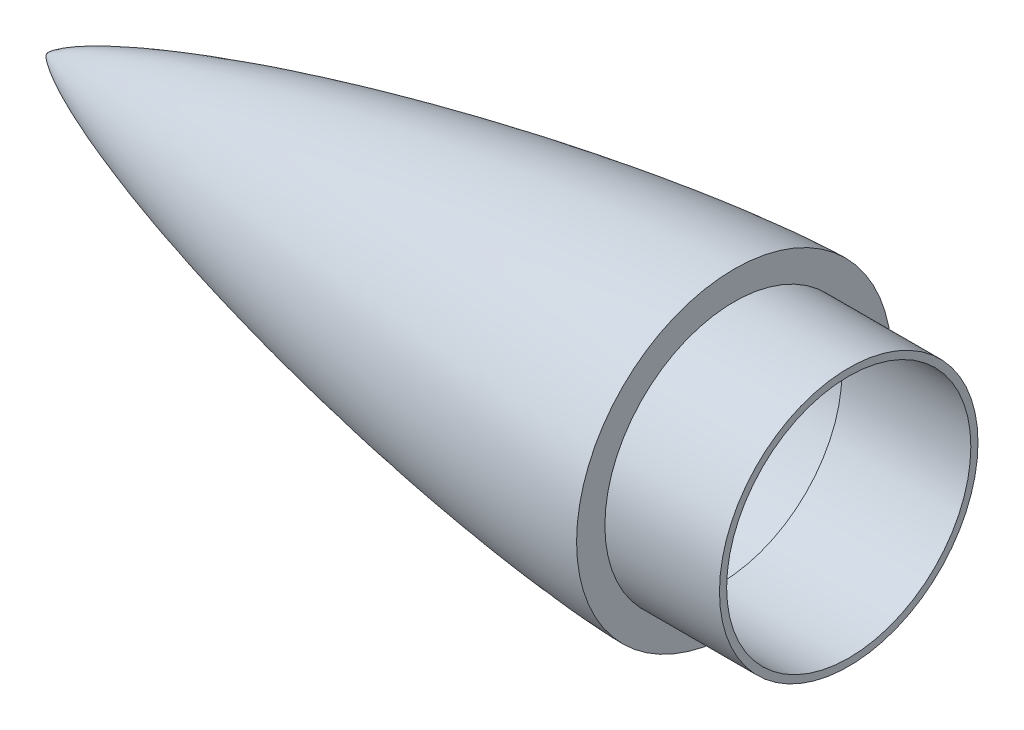
ISO-10303-21;
HEADER;
FILE_DESCRIPTION(('STEP AP214'),'2;1');
FILE_NAME('part.step','',(''),(''),'','','');
FILE_SCHEMA(('AUTOMOTIVE_DESIGN { 1 0 10303 214 1 1 1 1 }'));
ENDSEC;
DATA;
#1=APPLICATION_CONTEXT('core data for automotive mechanical design processes');
#2=APPLICATION_PROTOCOL_DEFINITION('international standard','automotive_design',2000,#1);
#3=PRODUCT_CONTEXT('',#1,'mechanical');
#4=PRODUCT('Part','Part','',(#3));
#5=PRODUCT_RELATED_PRODUCT_CATEGORY('part','',(#4));
#6=PRODUCT_DEFINITION_FORMATION('','',#4);
#7=PRODUCT_DEFINITION_CONTEXT('part definition',#1,'design');
#8=PRODUCT_DEFINITION('design','',#6,#7);
#9=PRODUCT_DEFINITION_SHAPE('','',#8);
#10=(LENGTH_UNIT() NAMED_UNIT(*) SI_UNIT(.MILLI.,.METRE.));
#11=(NAMED_UNIT(*) PLANE_ANGLE_UNIT() SI_UNIT($,.RADIAN.));
#12=(NAMED_UNIT(*) SI_UNIT($,.STERADIAN.) SOLID_ANGLE_UNIT());
#13=UNCERTAINTY_MEASURE_WITH_UNIT(LENGTH_MEASURE(1.E-05),#10,'distance_accuracy_value','');
#14=(GEOMETRIC_REPRESENTATION_CONTEXT(3) GLOBAL_UNCERTAINTY_ASSIGNED_CONTEXT((#13)) GLOBAL_UNIT_ASSIGNED_CONTEXT((#10,
#11,#12)) REPRESENTATION_CONTEXT('',''));
#15=CARTESIAN_POINT('',(0.,0.,0.));
#16=DIRECTION('',(0.,0.,1.));
#17=DIRECTION('',(1.,0.,0.));
#18=AXIS2_PLACEMENT_3D('',#15,#16,#17);
#19=CARTESIAN_POINT('',(177.8,0.,0.));
#20=DIRECTION('',(1.,0.,0.));
#21=DIRECTION('',(0.,0.,-1.));
#22=AXIS2_PLACEMENT_3D('',#19,#20,#21);
#23=PLANE('',#22);
#24=CARTESIAN_POINT('',(177.8,0.,0.));
#25=DIRECTION('',(1.,0.,0.));
#26=DIRECTION('',(0.,0.,-1.));
#27=AXIS2_PLACEMENT_3D('',#24,#25,#26);
#28=CIRCLE('',#27,27.0637);
#29=CARTESIAN_POINT('',(177.8,0.,-27.0637));
#30=VERTEX_POINT('',#29);
#31=EDGE_CURVE('E180',#30,#30,#28,.T.);
#32=ORIENTED_EDGE('',*,*,#31,.F.);
#33=EDGE_LOOP('',(#32));
#34=FACE_BOUND('',#33,.T.);
#35=CARTESIAN_POINT('',(177.8,0.,0.));
#36=DIRECTION('',(1.,0.,0.));
#37=DIRECTION('',(0.,0.,-1.));
#38=AXIS2_PLACEMENT_3D('',#35,#36,#37);
#39=CIRCLE('',#38,28.6512);
#40=CARTESIAN_POINT('',(177.8,0.,-28.6512));
#41=VERTEX_POINT('',#40);
#42=EDGE_CURVE('E75',#41,#41,#39,.T.);
#43=ORIENTED_EDGE('',*,*,#42,.T.);
#44=EDGE_LOOP('',(#43));
#45=FACE_BOUND('',#44,.T.);
#46=ADVANCED_FACE('F45',(#34,#45),#23,.T.);
#47=CARTESIAN_POINT('',(71.362168763472,0.,0.));
#48=DIRECTION('',(1.,0.,0.));
#49=DIRECTION('',(0.,0.,-1.));
#50=AXIS2_PLACEMENT_3D('',#47,#48,#49);
#51=CYLINDRICAL_SURFACE('',#50,28.6512);
#52=ORIENTED_EDGE('',*,*,#42,.F.);
#53=EDGE_LOOP('',(#52));
#54=FACE_BOUND('',#53,.T.);
#55=CARTESIAN_POINT('',(152.4,0.,0.));
#56=DIRECTION('',(-1.,0.,0.));
#57=DIRECTION('',(0.,0.,1.));
#58=AXIS2_PLACEMENT_3D('',#55,#56,#57);
#59=CIRCLE('',#58,28.6512);
#60=CARTESIAN_POINT('',(152.4,0.,28.6512));
#61=VERTEX_POINT('',#60);
#62=EDGE_CURVE('E70',#61,#61,#59,.F.);
#63=ORIENTED_EDGE('',*,*,#62,.T.);
#64=EDGE_LOOP('',(#63));
#65=FACE_BOUND('',#64,.T.);
#66=ADVANCED_FACE('F94',(#54,#65),#51,.T.);
#67=CARTESIAN_POINT('',(152.4,34.925,0.));
#68=CARTESIAN_POINT('',(151.638620403702,34.9194325249245,0.));
#69=CARTESIAN_POINT('',(150.116291690404,34.8790390472772,0.));
#70=CARTESIAN_POINT('',(146.127711045371,34.7091570131924,0.));
#71=CARTESIAN_POINT('',(139.681201199576,34.2625408582786,0.));
#72=CARTESIAN_POINT('',(131.546640375975,33.5052440705498,0.));
#73=CARTESIAN_POINT('',(121.735757233919,32.3602207304823,0.));
#74=CARTESIAN_POINT('',(111.94913797379,31.0255536240622,0.));
#75=CARTESIAN_POINT('',(102.187264387121,29.5206815706249,0.));
#76=CARTESIAN_POINT('',(92.4511603041206,27.8577465560751,0.));
#77=CARTESIAN_POINT('',(82.7423972328781,26.0418601860915,0.));
#78=CARTESIAN_POINT('',(73.0633276580109,24.0739458337446,0.));
#79=CARTESIAN_POINT('',(63.4171761954773,21.9502079468408,0.));
#80=CARTESIAN_POINT('',(53.8087242934331,19.6618360702933,0.));
#81=CARTESIAN_POINT('',(44.2446567136395,17.1937502861845,0.));
#82=CARTESIAN_POINT('',(34.7357419206715,14.520517201272,0.));
#83=CARTESIAN_POINT('',(25.5104046531744,11.6665355833011,0.));
#84=CARTESIAN_POINT('',(17.5514722834625,8.91057275298538,0.));
#85=CARTESIAN_POINT('',(11.1670070265519,6.40395576528129,0.));
#86=CARTESIAN_POINT('',(6.67803927516961,4.37287257201954,0.));
#87=CARTESIAN_POINT('',(4.00847873967701,2.99416996745783,0.));
#88=CARTESIAN_POINT('',(2.31812751021087,1.98889969974508,0.));
#89=CARTESIAN_POINT('',(1.34348677876688,1.32206697154695,0.));
#90=CARTESIAN_POINT('',(0.781053510275957,0.880548595209868,0.));
#91=CARTESIAN_POINT('',(0.455946687706086,0.58803699710236,0.));
#92=CARTESIAN_POINT('',(0.271737065795398,0.398631991697191,0.));
#93=CARTESIAN_POINT('',(0.161926751431604,0.270389036460891,0.));
#94=CARTESIAN_POINT('',(0.0929199021123111,0.178619413427055,0.));
#95=CARTESIAN_POINT('',(0.0510718148425158,0.115014644762597,0.));
#96=CARTESIAN_POINT('',(0.0216249122266529,0.0612968553276348,0.));
#97=CARTESIAN_POINT('',(0.00674560588766467,0.0270528948989666,0.));
#98=CARTESIAN_POINT('',(0.00182604402718294,0.00914699952168585,0.));
#99=CARTESIAN_POINT('',(0.,0.,0.));
#100=B_SPLINE_CURVE_WITH_KNOTS('',4,(#67,#68,#69,#70,#71,#72,#73,#74,#75,#76,#77,#78,#79,#80,
#81,#82,#83,#84,#85,#86,#87,#88,#89,#90,#91,#92,#93,#94,#95,#96,#97,#98,#99),.UNSPECIFIED.,.F.,
.F.,(5,1,1,1,1,1,1,1,1,1,1,1,1,1,1,1,1,1,1,1,1,1,1,1,1,1,1,1,1,5),(0.,0.0193267542035633,
0.0386535084071268,0.101330712024184,0.164007917995149,0.226685116508925,0.289362322768752,
0.352039522084498,0.414716724147272,0.47739392669663,0.540071132636711,0.602748330536206,
0.665425535593083,0.728102733489807,0.79077993577167,0.853457143410815,0.910513336332061,
0.941851891266166,0.96481680707495,0.978476881341063,0.98674069077858,0.991743607613548,
0.994773177110498,0.996614547336969,0.997833583423055,0.998445927734003,0.999055788205813,
0.999527894102907,0.999763947051453,1.),.UNSPECIFIED.);
#101=CARTESIAN_POINT('',(0.,0.,0.));
#102=DIRECTION('',(-1.,0.,0.));
#103=AXIS1_PLACEMENT('',#101,#102);
#104=SURFACE_OF_REVOLUTION('',#100,#103);
#105=CARTESIAN_POINT('',(0.,0.,0.));
#106=VERTEX_POINT('',#105);
#107=VERTEX_LOOP('',#106);
#108=FACE_BOUND('',#107,.T.);
#109=CARTESIAN_POINT('',(152.4,0.,0.));
#110=DIRECTION('',(-1.,0.,0.));
#111=DIRECTION('',(0.,0.,1.));
#112=AXIS2_PLACEMENT_3D('',#109,#110,#111);
#113=CIRCLE('',#112,34.925);
#114=CARTESIAN_POINT('',(152.4,0.,34.925));
#115=VERTEX_POINT('',#114);
#116=EDGE_CURVE('E11',#115,#115,#113,.T.);
#117=ORIENTED_EDGE('',*,*,#116,.T.);
#118=EDGE_LOOP('',(#117));
#119=FACE_BOUND('',#118,.T.);
#120=ADVANCED_FACE('F92',(#108,#119),#104,.T.);
#121=CARTESIAN_POINT('',(152.4,0.,0.));
#122=DIRECTION('',(-1.,0.,0.));
#123=DIRECTION('',(0.,0.,1.));
#124=AXIS2_PLACEMENT_3D('',#121,#122,#123);
#125=PLANE('',#124);
#126=ORIENTED_EDGE('',*,*,#62,.F.);
#127=EDGE_LOOP('',(#126));
#128=FACE_BOUND('',#127,.T.);
#129=ORIENTED_EDGE('',*,*,#116,.F.);
#130=EDGE_LOOP('',(#129));
#131=FACE_BOUND('',#130,.T.);
#132=ADVANCED_FACE('F47',(#128,#131),#125,.F.);
#133=CARTESIAN_POINT('',(152.4,0.,0.));
#134=DIRECTION('',(-1.,0.,0.));
#135=DIRECTION('',(0.,0.,1.));
#136=AXIS2_PLACEMENT_3D('',#133,#134,#135);
#137=CYLINDRICAL_SURFACE('',#136,27.0637);
#138=CARTESIAN_POINT('',(149.225,0.,0.));
#139=DIRECTION('',(1.,0.,0.));
#140=DIRECTION('',(0.,0.,-1.));
#141=AXIS2_PLACEMENT_3D('',#138,#139,#140);
#142=CIRCLE('',#141,27.0637);
#143=CARTESIAN_POINT('',(149.225,0.,-27.0637));
#144=VERTEX_POINT('',#143);
#145=EDGE_CURVE('E68',#144,#144,#142,.T.);
#146=ORIENTED_EDGE('',*,*,#145,.F.);
#147=EDGE_LOOP('',(#146));
#148=FACE_BOUND('',#147,.T.);
#149=ORIENTED_EDGE('',*,*,#31,.T.);
#150=EDGE_LOOP('',(#149));
#151=FACE_BOUND('',#150,.T.);
#152=ADVANCED_FACE('F63',(#148,#151),#137,.F.);
#153=CARTESIAN_POINT('',(152.4,34.925,0.));
#154=CARTESIAN_POINT('',(151.638620403702,34.9194325249245,0.));
#155=CARTESIAN_POINT('',(150.116291690404,34.8790390472772,0.));
#156=CARTESIAN_POINT('',(146.127711045371,34.7091570131924,0.));
#157=CARTESIAN_POINT('',(139.681201199576,34.2625408582786,0.));
#158=CARTESIAN_POINT('',(131.546640375975,33.5052440705498,0.));
#159=CARTESIAN_POINT('',(121.735757233919,32.3602207304823,0.));
#160=CARTESIAN_POINT('',(111.94913797379,31.0255536240622,0.));
#161=CARTESIAN_POINT('',(102.187264387121,29.5206815706249,0.));
#162=CARTESIAN_POINT('',(92.4511603041206,27.8577465560751,0.));
#163=CARTESIAN_POINT('',(82.7423972328781,26.0418601860915,0.));
#164=CARTESIAN_POINT('',(73.0633276580109,24.0739458337446,0.));
#165=CARTESIAN_POINT('',(63.4171761954773,21.9502079468408,0.));
#166=CARTESIAN_POINT('',(53.8087242934331,19.6618360702933,0.));
#167=CARTESIAN_POINT('',(44.2446567136395,17.1937502861845,0.));
#168=CARTESIAN_POINT('',(34.7357419206715,14.520517201272,0.));
#169=CARTESIAN_POINT('',(25.5104046531744,11.6665355833011,0.));
#170=CARTESIAN_POINT('',(17.5514722834625,8.91057275298538,0.));
#171=CARTESIAN_POINT('',(11.1670070265519,6.40395576528129,0.));
#172=CARTESIAN_POINT('',(6.96039128041502,4.50062586502573,0.));
#173=CARTESIAN_POINT('',(4.84947585756546,3.42641490771534,0.));
#174=CARTESIAN_POINT('',(3.8580975905058,2.87768653179376,0.));
#175=CARTESIAN_POINT('',(3.6591941287593,2.76551042978167,0.));
#176=B_SPLINE_CURVE_WITH_KNOTS('',4,(#153,#154,#155,#156,#157,#158,#159,#160,#161,#162,#163,
#164,#165,#166,#167,#168,#169,#170,#171,#172,#173,#174,#175),.UNSPECIFIED.,.F.,.F.,(5,1,1,1,1,1,
1,1,1,1,1,1,1,1,1,1,1,1,1,5),(0.,0.0193267542035633,0.0386535084071268,0.101330712024184,
0.164007917995149,0.226685116508925,0.289362322768752,0.352039522084498,0.414716724147272,
0.47739392669663,0.540071132636711,0.602748330536206,0.665425535593083,0.728102733489807,
0.79077993577167,0.853457143410815,0.910513336332061,0.941851891266166,0.96481680707495,
0.970613253073965),.UNSPECIFIED.);
#177=CARTESIAN_POINT('',(0.,0.,0.));
#178=DIRECTION('',(-1.,0.,0.));
#179=AXIS1_PLACEMENT('',#177,#178);
#180=SURFACE_OF_REVOLUTION('',#176,#179);
#181=OFFSET_SURFACE('',#180,-3.175,.F.);
#182=CARTESIAN_POINT('',(5.21886622980132,0.,0.));
#183=VERTEX_POINT('',#182);
#184=VERTEX_LOOP('',#183);
#185=FACE_BOUND('',#184,.T.);
#186=CARTESIAN_POINT('',(149.225,0.,0.));
#187=DIRECTION('',(-1.,0.,0.));
#188=DIRECTION('',(0.,0.,1.));
#189=AXIS2_PLACEMENT_3D('',#186,#187,#188);
#190=CIRCLE('',#189,31.658375956532);
#191=CARTESIAN_POINT('',(149.225,0.,31.658375956532));
#192=VERTEX_POINT('',#191);
#193=EDGE_CURVE('E49',#192,#192,#190,.F.);
#194=ORIENTED_EDGE('',*,*,#193,.T.);
#195=EDGE_LOOP('',(#194));
#196=FACE_BOUND('',#195,.T.);
#197=ADVANCED_FACE('F59',(#185,#196),#181,.F.);
#198=CARTESIAN_POINT('',(149.225,0.,0.));
#199=DIRECTION('',(1.,0.,0.));
#200=DIRECTION('',(0.,0.,-1.));
#201=AXIS2_PLACEMENT_3D('',#198,#199,#200);
#202=PLANE('',#201);
#203=ORIENTED_EDGE('',*,*,#193,.F.);
#204=EDGE_LOOP('',(#203));
#205=FACE_BOUND('',#204,.T.);
#206=ORIENTED_EDGE('',*,*,#145,.T.);
#207=EDGE_LOOP('',(#206));
#208=FACE_BOUND('',#207,.T.);
#209=ADVANCED_FACE('F62',(#205,#208),#202,.F.);
#210=CLOSED_SHELL('',(#46,#66,#120,#132,#152,#197,#209));
#211=MANIFOLD_SOLID_BREP('B2',#210);
#212=ADVANCED_BREP_SHAPE_REPRESENTATION('',(#18,#211),#14);
#213=SHAPE_DEFINITION_REPRESENTATION(#9,#212);
ENDSEC;
END-ISO-10303-21;
